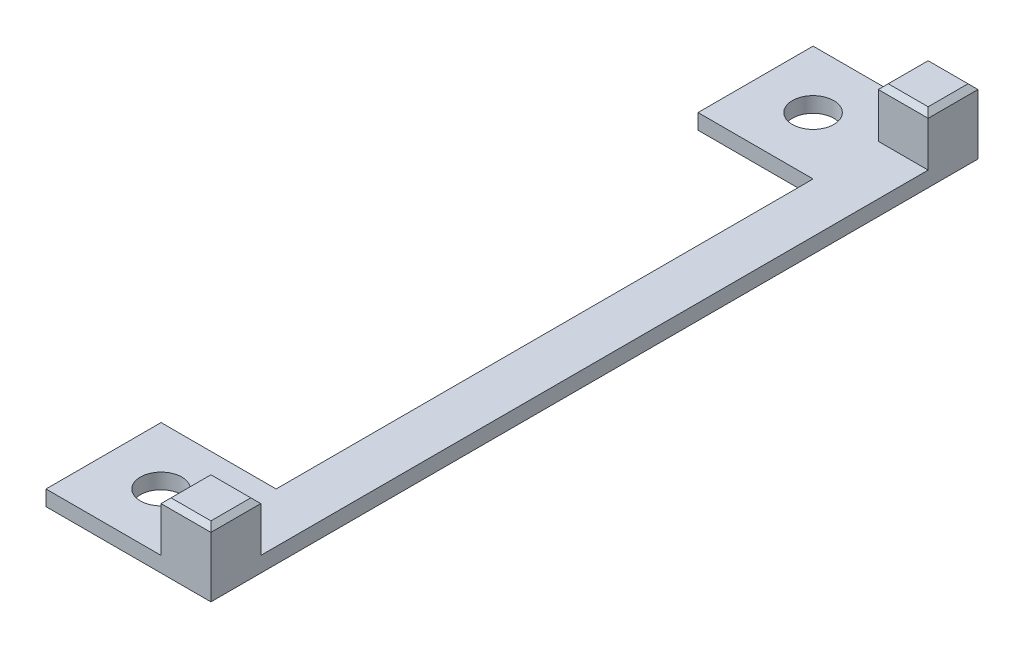
ISO-10303-21;
HEADER;
FILE_DESCRIPTION(('STEP AP214'),'2;1');
FILE_NAME('part.step','',(''),(''),'','','');
FILE_SCHEMA(('AUTOMOTIVE_DESIGN { 1 0 10303 214 1 1 1 1 }'));
ENDSEC;
DATA;
#1=APPLICATION_CONTEXT('core data for automotive mechanical design processes');
#2=APPLICATION_PROTOCOL_DEFINITION('international standard','automotive_design',2000,#1);
#3=PRODUCT_CONTEXT('',#1,'mechanical');
#4=PRODUCT('Part','Part','',(#3));
#5=PRODUCT_RELATED_PRODUCT_CATEGORY('part','',(#4));
#6=PRODUCT_DEFINITION_FORMATION('','',#4);
#7=PRODUCT_DEFINITION_CONTEXT('part definition',#1,'design');
#8=PRODUCT_DEFINITION('design','',#6,#7);
#9=PRODUCT_DEFINITION_SHAPE('','',#8);
#10=(LENGTH_UNIT() NAMED_UNIT(*) SI_UNIT(.MILLI.,.METRE.));
#11=(NAMED_UNIT(*) PLANE_ANGLE_UNIT() SI_UNIT($,.RADIAN.));
#12=(NAMED_UNIT(*) SI_UNIT($,.STERADIAN.) SOLID_ANGLE_UNIT());
#13=UNCERTAINTY_MEASURE_WITH_UNIT(LENGTH_MEASURE(1.E-05),#10,'distance_accuracy_value','');
#14=(GEOMETRIC_REPRESENTATION_CONTEXT(3) GLOBAL_UNCERTAINTY_ASSIGNED_CONTEXT((#13)) GLOBAL_UNIT_ASSIGNED_CONTEXT((#10,
#11,#12)) REPRESENTATION_CONTEXT('',''));
#15=CARTESIAN_POINT('',(0.,0.,0.));
#16=DIRECTION('',(0.,0.,1.));
#17=DIRECTION('',(1.,0.,0.));
#18=AXIS2_PLACEMENT_3D('',#15,#16,#17);
#19=CARTESIAN_POINT('',(-3.40641711229946,2.,90.2326203208556));
#20=DIRECTION('',(1.,0.,0.));
#21=DIRECTION('',(0.,0.,-1.));
#22=AXIS2_PLACEMENT_3D('',#19,#20,#21);
#23=PLANE('',#22);
#24=DIRECTION('',(0.,1.,0.));
#25=VECTOR('',#24,1.);
#26=CARTESIAN_POINT('',(-3.40641711229946,0.,81.7326203208556));
#27=LINE('',#26,#25);
#28=CARTESIAN_POINT('',(-3.40641711229946,0.,81.7326203208556));
#29=VERTEX_POINT('',#28);
#30=CARTESIAN_POINT('',(-3.40641711229946,2.,81.7326203208556));
#31=VERTEX_POINT('',#30);
#32=EDGE_CURVE('E346',#29,#31,#27,.T.);
#33=ORIENTED_EDGE('',*,*,#32,.T.);
#34=DIRECTION('',(0.,0.,1.));
#35=VECTOR('',#34,1.);
#36=CARTESIAN_POINT('',(-3.40641711229946,2.,90.2326203208556));
#37=LINE('',#36,#35);
#38=CARTESIAN_POINT('',(-3.40641711229946,2.,11.7326203208556));
#39=VERTEX_POINT('',#38);
#40=EDGE_CURVE('E221',#39,#31,#37,.T.);
#41=ORIENTED_EDGE('',*,*,#40,.F.);
#42=DIRECTION('',(0.,1.,0.));
#43=VECTOR('',#42,1.);
#44=CARTESIAN_POINT('',(-3.40641711229946,0.,11.7326203208556));
#45=LINE('',#44,#43);
#46=CARTESIAN_POINT('',(-3.40641711229946,0.,11.7326203208556));
#47=VERTEX_POINT('',#46);
#48=EDGE_CURVE('E245',#47,#39,#45,.T.);
#49=ORIENTED_EDGE('',*,*,#48,.F.);
#50=DIRECTION('',(0.,0.,1.));
#51=VECTOR('',#50,1.);
#52=CARTESIAN_POINT('',(-3.40641711229946,0.,90.2326203208556));
#53=LINE('',#52,#51);
#54=EDGE_CURVE('E226',#47,#29,#53,.T.);
#55=ORIENTED_EDGE('',*,*,#54,.T.);
#56=EDGE_LOOP('',(#33,#41,#49,#55));
#57=FACE_BOUND('',#56,.T.);
#58=ADVANCED_FACE('F45',(#57),#23,.F.);
#59=CARTESIAN_POINT('',(-3.40641711229946,8.5,3.23262032085562));
#60=DIRECTION('',(0.,0.,-1.));
#61=DIRECTION('',(-1.,0.,0.));
#62=AXIS2_PLACEMENT_3D('',#59,#60,#61);
#63=PLANE('',#62);
#64=DIRECTION('',(0.,-1.,0.));
#65=VECTOR('',#64,1.);
#66=CARTESIAN_POINT('',(3.09358288770054,8.5,3.23262032085562));
#67=LINE('',#66,#65);
#68=CARTESIAN_POINT('',(3.09358288770054,7.85,3.23262032085561));
#69=VERTEX_POINT('',#68);
#70=CARTESIAN_POINT('',(3.09358288770054,2.,3.23262032085562));
#71=VERTEX_POINT('',#70);
#72=EDGE_CURVE('E296',#69,#71,#67,.T.);
#73=ORIENTED_EDGE('',*,*,#72,.F.);
#74=DIRECTION('',(-1.,0.,0.));
#75=VECTOR('',#74,1.);
#76=CARTESIAN_POINT('',(3.09358288770054,7.85,3.23262032085562));
#77=LINE('',#76,#75);
#78=CARTESIAN_POINT('',(-3.40641711229947,7.85,3.23262032085562));
#79=VERTEX_POINT('',#78);
#80=EDGE_CURVE('E424',#69,#79,#77,.T.);
#81=ORIENTED_EDGE('',*,*,#80,.T.);
#82=DIRECTION('',(0.,-1.,0.));
#83=VECTOR('',#82,1.);
#84=CARTESIAN_POINT('',(-3.40641711229946,8.5,3.23262032085562));
#85=LINE('',#84,#83);
#86=CARTESIAN_POINT('',(-3.40641711229946,2.,3.23262032085562));
#87=VERTEX_POINT('',#86);
#88=EDGE_CURVE('E271',#79,#87,#85,.T.);
#89=ORIENTED_EDGE('',*,*,#88,.T.);
#90=DIRECTION('',(-1.,0.,0.));
#91=VECTOR('',#90,1.);
#92=CARTESIAN_POINT('',(-3.40641711229946,2.,3.23262032085562));
#93=LINE('',#92,#91);
#94=EDGE_CURVE('E234',#71,#87,#93,.T.);
#95=ORIENTED_EDGE('',*,*,#94,.F.);
#96=EDGE_LOOP('',(#73,#81,#89,#95));
#97=FACE_BOUND('',#96,.T.);
#98=ADVANCED_FACE('F423',(#97),#63,.F.);
#99=CARTESIAN_POINT('',(-3.40641711229946,8.5,-3.26737967914438));
#100=DIRECTION('',(1.,0.,0.));
#101=DIRECTION('',(0.,0.,-1.));
#102=AXIS2_PLACEMENT_3D('',#99,#100,#101);
#103=PLANE('',#102);
#104=ORIENTED_EDGE('',*,*,#88,.F.);
#105=DIRECTION('',(0.,0.,-1.));
#106=VECTOR('',#105,1.);
#107=CARTESIAN_POINT('',(-3.40641711229946,7.85,96.7326203208556));
#108=LINE('',#107,#106);
#109=CARTESIAN_POINT('',(-3.40641711229946,7.85,-3.26737967914438));
#110=VERTEX_POINT('',#109);
#111=EDGE_CURVE('E176',#79,#110,#108,.T.);
#112=ORIENTED_EDGE('',*,*,#111,.T.);
#113=DIRECTION('',(0.,-1.,0.));
#114=VECTOR('',#113,1.);
#115=CARTESIAN_POINT('',(-3.40641711229946,8.5,-3.26737967914438));
#116=LINE('',#115,#114);
#117=CARTESIAN_POINT('',(-3.40641711229946,2.,-3.26737967914438));
#118=VERTEX_POINT('',#117);
#119=EDGE_CURVE('E290',#110,#118,#116,.T.);
#120=ORIENTED_EDGE('',*,*,#119,.T.);
#121=DIRECTION('',(0.,0.,-1.));
#122=VECTOR('',#121,1.);
#123=CARTESIAN_POINT('',(-3.40641711229946,2.,-3.26737967914438));
#124=LINE('',#123,#122);
#125=EDGE_CURVE('E266',#87,#118,#124,.T.);
#126=ORIENTED_EDGE('',*,*,#125,.F.);
#127=EDGE_LOOP('',(#104,#112,#120,#126));
#128=FACE_BOUND('',#127,.T.);
#129=ADVANCED_FACE('F47',(#128),#103,.F.);
#130=CARTESIAN_POINT('',(3.09358288770054,8.5,-3.26737967914438));
#131=DIRECTION('',(-1.,0.,0.));
#132=DIRECTION('',(0.,0.,1.));
#133=AXIS2_PLACEMENT_3D('',#130,#131,#132);
#134=PLANE('',#133);
#135=DIRECTION('',(0.,-1.,0.));
#136=VECTOR('',#135,1.);
#137=CARTESIAN_POINT('',(3.09358288770054,8.5,-3.26737967914438));
#138=LINE('',#137,#136);
#139=CARTESIAN_POINT('',(3.09358288770054,7.85,-3.26737967914438));
#140=VERTEX_POINT('',#139);
#141=CARTESIAN_POINT('',(3.09358288770054,0.,-3.26737967914438));
#142=VERTEX_POINT('',#141);
#143=EDGE_CURVE('E293',#140,#142,#138,.T.);
#144=ORIENTED_EDGE('',*,*,#143,.F.);
#145=DIRECTION('',(0.,0.,-1.));
#146=VECTOR('',#145,1.);
#147=CARTESIAN_POINT('',(3.09358288770054,7.85,96.7326203208556));
#148=LINE('',#147,#146);
#149=EDGE_CURVE('E343',#69,#140,#148,.T.);
#150=ORIENTED_EDGE('',*,*,#149,.F.);
#151=ORIENTED_EDGE('',*,*,#72,.T.);
#152=DIRECTION('',(0.,0.,-1.));
#153=VECTOR('',#152,1.);
#154=CARTESIAN_POINT('',(3.09358288770054,2.,90.2326203208556));
#155=LINE('',#154,#153);
#156=CARTESIAN_POINT('',(3.09358288770054,2.,90.2326203208556));
#157=VERTEX_POINT('',#156);
#158=EDGE_CURVE('E230',#157,#71,#155,.T.);
#159=ORIENTED_EDGE('',*,*,#158,.F.);
#160=DIRECTION('',(0.,-1.,0.));
#161=VECTOR('',#160,1.);
#162=CARTESIAN_POINT('',(3.09358288770054,8.5,90.2326203208556));
#163=LINE('',#162,#161);
#164=CARTESIAN_POINT('',(3.09358288770055,7.85,90.2326203208556));
#165=VERTEX_POINT('',#164);
#166=EDGE_CURVE('E209',#165,#157,#163,.T.);
#167=ORIENTED_EDGE('',*,*,#166,.F.);
#168=CARTESIAN_POINT('',(3.09358288770054,7.85,96.7326203208556));
#169=VERTEX_POINT('',#168);
#170=EDGE_CURVE('E319',#169,#165,#148,.T.);
#171=ORIENTED_EDGE('',*,*,#170,.F.);
#172=DIRECTION('',(0.,-1.,0.));
#173=VECTOR('',#172,1.);
#174=CARTESIAN_POINT('',(3.09358288770054,8.5,96.7326203208556));
#175=LINE('',#174,#173);
#176=CARTESIAN_POINT('',(3.09358288770054,0.,96.7326203208556));
#177=VERTEX_POINT('',#176);
#178=EDGE_CURVE('E196',#169,#177,#175,.T.);
#179=ORIENTED_EDGE('',*,*,#178,.T.);
#180=DIRECTION('',(0.,0.,-1.));
#181=VECTOR('',#180,1.);
#182=CARTESIAN_POINT('',(3.09358288770054,0.,-3.26737967914438));
#183=LINE('',#182,#181);
#184=EDGE_CURVE('E283',#177,#142,#183,.T.);
#185=ORIENTED_EDGE('',*,*,#184,.T.);
#186=EDGE_LOOP('',(#144,#150,#151,#159,#167,#171,#179,#185));
#187=FACE_BOUND('',#186,.T.);
#188=ADVANCED_FACE('F411',(#187),#134,.F.);
#189=CARTESIAN_POINT('',(-3.40641711229946,8.5,-3.26737967914438));
#190=DIRECTION('',(0.,0.,1.));
#191=DIRECTION('',(1.,0.,0.));
#192=AXIS2_PLACEMENT_3D('',#189,#190,#191);
#193=PLANE('',#192);
#194=ORIENTED_EDGE('',*,*,#119,.F.);
#195=DIRECTION('',(-1.,0.,0.));
#196=VECTOR('',#195,1.);
#197=CARTESIAN_POINT('',(3.09358288770054,7.85,-3.26737967914438));
#198=LINE('',#197,#196);
#199=EDGE_CURVE('E407',#140,#110,#198,.T.);
#200=ORIENTED_EDGE('',*,*,#199,.F.);
#201=ORIENTED_EDGE('',*,*,#143,.T.);
#202=DIRECTION('',(-1.,0.,0.));
#203=VECTOR('',#202,1.);
#204=CARTESIAN_POINT('',(-3.40641711229946,0.,-3.26737967914438));
#205=LINE('',#204,#203);
#206=CARTESIAN_POINT('',(-18.4064171122995,0.,-3.26737967914438));
#207=VERTEX_POINT('',#206);
#208=EDGE_CURVE('E287',#142,#207,#205,.T.);
#209=ORIENTED_EDGE('',*,*,#208,.T.);
#210=DIRECTION('',(0.,-1.,0.));
#211=VECTOR('',#210,1.);
#212=CARTESIAN_POINT('',(-18.4064171122995,0.,-3.26737967914438));
#213=LINE('',#212,#211);
#214=CARTESIAN_POINT('',(-18.4064171122995,2.,-3.26737967914438));
#215=VERTEX_POINT('',#214);
#216=EDGE_CURVE('E249',#215,#207,#213,.T.);
#217=ORIENTED_EDGE('',*,*,#216,.F.);
#218=DIRECTION('',(1.,0.,0.));
#219=VECTOR('',#218,1.);
#220=CARTESIAN_POINT('',(-18.4064171122995,2.,-3.26737967914438));
#221=LINE('',#220,#219);
#222=EDGE_CURVE('E262',#215,#118,#221,.T.);
#223=ORIENTED_EDGE('',*,*,#222,.T.);
#224=EDGE_LOOP('',(#194,#200,#201,#209,#217,#223));
#225=FACE_BOUND('',#224,.T.);
#226=ADVANCED_FACE('F403',(#225),#193,.F.);
#227=CARTESIAN_POINT('',(0.,8.5,0.));
#228=DIRECTION('',(0.,1.,0.));
#229=DIRECTION('',(0.,0.,1.));
#230=AXIS2_PLACEMENT_3D('',#227,#228,#229);
#231=PLANE('',#230);
#232=DIRECTION('',(0.,0.,-1.));
#233=VECTOR('',#232,1.);
#234=CARTESIAN_POINT('',(-2.75641711229946,8.5,96.7326203208556));
#235=LINE('',#234,#233);
#236=CARTESIAN_POINT('',(-2.75641711229947,8.5,2.58262032085562));
#237=VERTEX_POINT('',#236);
#238=CARTESIAN_POINT('',(-2.75641711229946,8.5,-2.61737967914438));
#239=VERTEX_POINT('',#238);
#240=EDGE_CURVE('E61',#237,#239,#235,.T.);
#241=ORIENTED_EDGE('',*,*,#240,.F.);
#242=DIRECTION('',(-1.,0.,0.));
#243=VECTOR('',#242,1.);
#244=CARTESIAN_POINT('',(3.09358288770054,8.5,2.58262032085562));
#245=LINE('',#244,#243);
#246=CARTESIAN_POINT('',(2.44358288770054,8.5,2.58262032085561));
#247=VERTEX_POINT('',#246);
#248=EDGE_CURVE('E339',#247,#237,#245,.T.);
#249=ORIENTED_EDGE('',*,*,#248,.F.);
#250=DIRECTION('',(0.,0.,-1.));
#251=VECTOR('',#250,1.);
#252=CARTESIAN_POINT('',(2.44358288770054,8.5,96.7326203208556));
#253=LINE('',#252,#251);
#254=CARTESIAN_POINT('',(2.44358288770053,8.5,-2.61737967914438));
#255=VERTEX_POINT('',#254);
#256=EDGE_CURVE('E329',#247,#255,#253,.T.);
#257=ORIENTED_EDGE('',*,*,#256,.T.);
#258=DIRECTION('',(-1.,0.,0.));
#259=VECTOR('',#258,1.);
#260=CARTESIAN_POINT('',(3.09358288770054,8.5,-2.61737967914438));
#261=LINE('',#260,#259);
#262=EDGE_CURVE('E435',#255,#239,#261,.T.);
#263=ORIENTED_EDGE('',*,*,#262,.T.);
#264=EDGE_LOOP('',(#241,#249,#257,#263));
#265=FACE_BOUND('',#264,.T.);
#266=ADVANCED_FACE('F451',(#265),#231,.T.);
#267=CARTESIAN_POINT('',(0.,0.,0.));
#268=DIRECTION('',(0.,1.,0.));
#269=DIRECTION('',(0.,0.,1.));
#270=AXIS2_PLACEMENT_3D('',#267,#268,#269);
#271=PLANE('',#270);
#272=DIRECTION('',(1.,0.,0.));
#273=VECTOR('',#272,1.);
#274=CARTESIAN_POINT('',(-18.4064171122995,0.,81.7326203208556));
#275=LINE('',#274,#273);
#276=CARTESIAN_POINT('',(-18.4064171122995,0.,81.7326203208556));
#277=VERTEX_POINT('',#276);
#278=EDGE_CURVE('E212',#277,#29,#275,.T.);
#279=ORIENTED_EDGE('',*,*,#278,.T.);
#280=ORIENTED_EDGE('',*,*,#54,.F.);
#281=DIRECTION('',(1.,0.,0.));
#282=VECTOR('',#281,1.);
#283=CARTESIAN_POINT('',(-18.4064171122995,0.,11.7326203208556));
#284=LINE('',#283,#282);
#285=CARTESIAN_POINT('',(-18.4064171122995,0.,11.7326203208556));
#286=VERTEX_POINT('',#285);
#287=EDGE_CURVE('E279',#286,#47,#284,.T.);
#288=ORIENTED_EDGE('',*,*,#287,.F.);
#289=DIRECTION('',(0.,0.,1.));
#290=VECTOR('',#289,1.);
#291=CARTESIAN_POINT('',(-18.4064171122995,0.,-3.26737967914438));
#292=LINE('',#291,#290);
#293=EDGE_CURVE('E253',#207,#286,#292,.T.);
#294=ORIENTED_EDGE('',*,*,#293,.F.);
#295=ORIENTED_EDGE('',*,*,#208,.F.);
#296=ORIENTED_EDGE('',*,*,#184,.F.);
#297=DIRECTION('',(-1.,0.,0.));
#298=VECTOR('',#297,1.);
#299=CARTESIAN_POINT('',(-3.40641711229946,0.,96.7326203208556));
#300=LINE('',#299,#298);
#301=CARTESIAN_POINT('',(-18.4064171122995,0.,96.7326203208556));
#302=VERTEX_POINT('',#301);
#303=EDGE_CURVE('E205',#177,#302,#300,.T.);
#304=ORIENTED_EDGE('',*,*,#303,.T.);
#305=DIRECTION('',(0.,0.,-1.));
#306=VECTOR('',#305,1.);
#307=CARTESIAN_POINT('',(-18.4064171122995,0.,96.7326203208556));
#308=LINE('',#307,#306);
#309=EDGE_CURVE('E352',#302,#277,#308,.T.);
#310=ORIENTED_EDGE('',*,*,#309,.T.);
#311=EDGE_LOOP('',(#279,#280,#288,#294,#295,#296,#304,#310));
#312=FACE_BOUND('',#311,.T.);
#313=CARTESIAN_POINT('',(-10.9064171122995,0.,4.23262032085562));
#314=DIRECTION('',(0.,1.,0.));
#315=DIRECTION('',(0.,0.,1.));
#316=AXIS2_PLACEMENT_3D('',#313,#314,#315);
#317=CIRCLE('',#316,2.7);
#318=CARTESIAN_POINT('',(-10.9064171122995,0.,6.93262032085562));
#319=VERTEX_POINT('',#318);
#320=EDGE_CURVE('E241',#319,#319,#317,.T.);
#321=ORIENTED_EDGE('',*,*,#320,.T.);
#322=EDGE_LOOP('',(#321));
#323=FACE_BOUND('',#322,.T.);
#324=CARTESIAN_POINT('',(-10.9064171122995,0.,89.2326203208556));
#325=DIRECTION('',(0.,-1.,0.));
#326=DIRECTION('',(0.,0.,-1.));
#327=AXIS2_PLACEMENT_3D('',#324,#325,#326);
#328=CIRCLE('',#327,2.7);
#329=CARTESIAN_POINT('',(-10.9064171122995,0.,86.5326203208556));
#330=VERTEX_POINT('',#329);
#331=EDGE_CURVE('E334',#330,#330,#328,.T.);
#332=ORIENTED_EDGE('',*,*,#331,.F.);
#333=EDGE_LOOP('',(#332));
#334=FACE_BOUND('',#333,.T.);
#335=ADVANCED_FACE('F378',(#312,#323,#334),#271,.F.);
#336=CARTESIAN_POINT('',(-18.4064171122995,0.,11.7326203208556));
#337=DIRECTION('',(0.,0.,-1.));
#338=DIRECTION('',(-1.,0.,0.));
#339=AXIS2_PLACEMENT_3D('',#336,#337,#338);
#340=PLANE('',#339);
#341=ORIENTED_EDGE('',*,*,#48,.T.);
#342=DIRECTION('',(1.,0.,0.));
#343=VECTOR('',#342,1.);
#344=CARTESIAN_POINT('',(-18.4064171122995,2.,11.7326203208556));
#345=LINE('',#344,#343);
#346=CARTESIAN_POINT('',(-18.4064171122995,2.,11.7326203208556));
#347=VERTEX_POINT('',#346);
#348=EDGE_CURVE('E275',#347,#39,#345,.T.);
#349=ORIENTED_EDGE('',*,*,#348,.F.);
#350=DIRECTION('',(0.,1.,0.));
#351=VECTOR('',#350,1.);
#352=CARTESIAN_POINT('',(-18.4064171122995,0.,11.7326203208556));
#353=LINE('',#352,#351);
#354=EDGE_CURVE('E256',#286,#347,#353,.T.);
#355=ORIENTED_EDGE('',*,*,#354,.F.);
#356=ORIENTED_EDGE('',*,*,#287,.T.);
#357=EDGE_LOOP('',(#341,#349,#355,#356));
#358=FACE_BOUND('',#357,.T.);
#359=ADVANCED_FACE('F394',(#358),#340,.F.);
#360=CARTESIAN_POINT('',(-18.4064171122995,2.,-3.26737967914438));
#361=DIRECTION('',(0.,-1.,0.));
#362=DIRECTION('',(0.,0.,-1.));
#363=AXIS2_PLACEMENT_3D('',#360,#361,#362);
#364=PLANE('',#363);
#365=CARTESIAN_POINT('',(-10.9064171122995,2.,4.23262032085562));
#366=DIRECTION('',(0.,1.,0.));
#367=DIRECTION('',(0.,0.,1.));
#368=AXIS2_PLACEMENT_3D('',#365,#366,#367);
#369=CIRCLE('',#368,2.7);
#370=CARTESIAN_POINT('',(-10.9064171122995,2.,6.93262032085562));
#371=VERTEX_POINT('',#370);
#372=EDGE_CURVE('E238',#371,#371,#369,.T.);
#373=ORIENTED_EDGE('',*,*,#372,.F.);
#374=EDGE_LOOP('',(#373));
#375=FACE_BOUND('',#374,.T.);
#376=ORIENTED_EDGE('',*,*,#348,.T.);
#377=ORIENTED_EDGE('',*,*,#40,.T.);
#378=DIRECTION('',(1.,0.,0.));
#379=VECTOR('',#378,1.);
#380=CARTESIAN_POINT('',(-18.4064171122995,2.,81.7326203208556));
#381=LINE('',#380,#379);
#382=CARTESIAN_POINT('',(-18.4064171122995,2.,81.7326203208556));
#383=VERTEX_POINT('',#382);
#384=EDGE_CURVE('E370',#383,#31,#381,.T.);
#385=ORIENTED_EDGE('',*,*,#384,.F.);
#386=DIRECTION('',(0.,0.,1.));
#387=VECTOR('',#386,1.);
#388=CARTESIAN_POINT('',(-18.4064171122995,2.,96.7326203208556));
#389=LINE('',#388,#387);
#390=CARTESIAN_POINT('',(-18.4064171122995,2.,96.7326203208556));
#391=VERTEX_POINT('',#390);
#392=EDGE_CURVE('E360',#383,#391,#389,.T.);
#393=ORIENTED_EDGE('',*,*,#392,.T.);
#394=DIRECTION('',(1.,0.,0.));
#395=VECTOR('',#394,1.);
#396=CARTESIAN_POINT('',(-18.4064171122995,2.,96.7326203208556));
#397=LINE('',#396,#395);
#398=CARTESIAN_POINT('',(-3.40641711229946,2.,96.7326203208556));
#399=VERTEX_POINT('',#398);
#400=EDGE_CURVE('E363',#391,#399,#397,.T.);
#401=ORIENTED_EDGE('',*,*,#400,.T.);
#402=DIRECTION('',(0.,0.,1.));
#403=VECTOR('',#402,1.);
#404=CARTESIAN_POINT('',(-3.40641711229946,2.,96.7326203208556));
#405=LINE('',#404,#403);
#406=CARTESIAN_POINT('',(-3.40641711229946,2.,90.2326203208556));
#407=VERTEX_POINT('',#406);
#408=EDGE_CURVE('E203',#407,#399,#405,.T.);
#409=ORIENTED_EDGE('',*,*,#408,.F.);
#410=DIRECTION('',(1.,0.,0.));
#411=VECTOR('',#410,1.);
#412=CARTESIAN_POINT('',(-3.40641711229946,2.,90.2326203208556));
#413=LINE('',#412,#411);
#414=EDGE_CURVE('E225',#407,#157,#413,.T.);
#415=ORIENTED_EDGE('',*,*,#414,.T.);
#416=ORIENTED_EDGE('',*,*,#158,.T.);
#417=ORIENTED_EDGE('',*,*,#94,.T.);
#418=ORIENTED_EDGE('',*,*,#125,.T.);
#419=ORIENTED_EDGE('',*,*,#222,.F.);
#420=DIRECTION('',(0.,0.,-1.));
#421=VECTOR('',#420,1.);
#422=CARTESIAN_POINT('',(-18.4064171122995,2.,-3.26737967914438));
#423=LINE('',#422,#421);
#424=EDGE_CURVE('E259',#347,#215,#423,.T.);
#425=ORIENTED_EDGE('',*,*,#424,.F.);
#426=EDGE_LOOP('',(#376,#377,#385,#393,#401,#409,#415,#416,#417,#418,#419,#425));
#427=FACE_BOUND('',#426,.T.);
#428=CARTESIAN_POINT('',(-10.9064171122995,2.,89.2326203208556));
#429=DIRECTION('',(0.,-1.,0.));
#430=DIRECTION('',(0.,0.,-1.));
#431=AXIS2_PLACEMENT_3D('',#428,#429,#430);
#432=CIRCLE('',#431,2.7);
#433=CARTESIAN_POINT('',(-10.9064171122995,2.,86.5326203208556));
#434=VERTEX_POINT('',#433);
#435=EDGE_CURVE('E328',#434,#434,#432,.T.);
#436=ORIENTED_EDGE('',*,*,#435,.T.);
#437=EDGE_LOOP('',(#436));
#438=FACE_BOUND('',#437,.T.);
#439=ADVANCED_FACE('F387',(#375,#427,#438),#364,.F.);
#440=CARTESIAN_POINT('',(-18.4064171122995,0.,0.));
#441=DIRECTION('',(1.,0.,0.));
#442=DIRECTION('',(0.,0.,-1.));
#443=AXIS2_PLACEMENT_3D('',#440,#441,#442);
#444=PLANE('',#443);
#445=ORIENTED_EDGE('',*,*,#216,.T.);
#446=ORIENTED_EDGE('',*,*,#293,.T.);
#447=ORIENTED_EDGE('',*,*,#354,.T.);
#448=ORIENTED_EDGE('',*,*,#424,.T.);
#449=EDGE_LOOP('',(#445,#446,#447,#448));
#450=FACE_BOUND('',#449,.T.);
#451=ADVANCED_FACE('F400',(#450),#444,.F.);
#452=CARTESIAN_POINT('',(-10.9064171122995,0.,4.23262032085562));
#453=DIRECTION('',(0.,1.,0.));
#454=DIRECTION('',(0.,0.,1.));
#455=AXIS2_PLACEMENT_3D('',#452,#453,#454);
#456=CYLINDRICAL_SURFACE('',#455,2.7);
#457=ORIENTED_EDGE('',*,*,#320,.F.);
#458=EDGE_LOOP('',(#457));
#459=FACE_BOUND('',#458,.T.);
#460=ORIENTED_EDGE('',*,*,#372,.T.);
#461=EDGE_LOOP('',(#460));
#462=FACE_BOUND('',#461,.T.);
#463=ADVANCED_FACE('F475',(#459,#462),#456,.F.);
#464=CARTESIAN_POINT('',(-3.40641711229946,8.5,90.2326203208556));
#465=DIRECTION('',(0.,0.,1.));
#466=DIRECTION('',(-1.,0.,0.));
#467=AXIS2_PLACEMENT_3D('',#464,#465,#466);
#468=PLANE('',#467);
#469=DIRECTION('',(0.,-1.,0.));
#470=VECTOR('',#469,1.);
#471=CARTESIAN_POINT('',(-3.40641711229946,8.5,90.2326203208556));
#472=LINE('',#471,#470);
#473=CARTESIAN_POINT('',(-3.40641711229947,7.85,90.2326203208556));
#474=VERTEX_POINT('',#473);
#475=EDGE_CURVE('E218',#474,#407,#472,.T.);
#476=ORIENTED_EDGE('',*,*,#475,.F.);
#477=DIRECTION('',(-1.,0.,0.));
#478=VECTOR('',#477,1.);
#479=CARTESIAN_POINT('',(3.09358288770055,7.85,90.2326203208556));
#480=LINE('',#479,#478);
#481=EDGE_CURVE('E440',#165,#474,#480,.T.);
#482=ORIENTED_EDGE('',*,*,#481,.F.);
#483=ORIENTED_EDGE('',*,*,#166,.T.);
#484=ORIENTED_EDGE('',*,*,#414,.F.);
#485=EDGE_LOOP('',(#476,#482,#483,#484));
#486=FACE_BOUND('',#485,.T.);
#487=ADVANCED_FACE('F477',(#486),#468,.F.);
#488=CARTESIAN_POINT('',(-3.40641711229946,8.5,96.7326203208556));
#489=DIRECTION('',(1.,0.,0.));
#490=DIRECTION('',(0.,0.,1.));
#491=AXIS2_PLACEMENT_3D('',#488,#489,#490);
#492=PLANE('',#491);
#493=DIRECTION('',(0.,-1.,0.));
#494=VECTOR('',#493,1.);
#495=CARTESIAN_POINT('',(-3.40641711229946,8.5,96.7326203208556));
#496=LINE('',#495,#494);
#497=CARTESIAN_POINT('',(-3.40641711229946,7.85,96.7326203208556));
#498=VERTEX_POINT('',#497);
#499=EDGE_CURVE('E193',#498,#399,#496,.T.);
#500=ORIENTED_EDGE('',*,*,#499,.F.);
#501=EDGE_CURVE('E168',#498,#474,#108,.T.);
#502=ORIENTED_EDGE('',*,*,#501,.T.);
#503=ORIENTED_EDGE('',*,*,#475,.T.);
#504=ORIENTED_EDGE('',*,*,#408,.T.);
#505=EDGE_LOOP('',(#500,#502,#503,#504));
#506=FACE_BOUND('',#505,.T.);
#507=ADVANCED_FACE('F201',(#506),#492,.F.);
#508=CARTESIAN_POINT('',(-3.40641711229946,8.5,96.7326203208556));
#509=DIRECTION('',(0.,0.,-1.));
#510=DIRECTION('',(1.,0.,0.));
#511=AXIS2_PLACEMENT_3D('',#508,#509,#510);
#512=PLANE('',#511);
#513=ORIENTED_EDGE('',*,*,#178,.F.);
#514=DIRECTION('',(-1.,0.,0.));
#515=VECTOR('',#514,1.);
#516=CARTESIAN_POINT('',(3.09358288770055,7.85,96.7326203208556));
#517=LINE('',#516,#515);
#518=EDGE_CURVE('E182',#169,#498,#517,.T.);
#519=ORIENTED_EDGE('',*,*,#518,.T.);
#520=ORIENTED_EDGE('',*,*,#499,.T.);
#521=ORIENTED_EDGE('',*,*,#400,.F.);
#522=DIRECTION('',(0.,-1.,0.));
#523=VECTOR('',#522,1.);
#524=CARTESIAN_POINT('',(-18.4064171122995,0.,96.7326203208556));
#525=LINE('',#524,#523);
#526=EDGE_CURVE('E348',#391,#302,#525,.T.);
#527=ORIENTED_EDGE('',*,*,#526,.T.);
#528=ORIENTED_EDGE('',*,*,#303,.F.);
#529=EDGE_LOOP('',(#513,#519,#520,#521,#527,#528));
#530=FACE_BOUND('',#529,.T.);
#531=ADVANCED_FACE('F191',(#530),#512,.F.);
#532=CARTESIAN_POINT('',(0.,8.5,93.4652406417112));
#533=DIRECTION('',(0.,1.,0.));
#534=DIRECTION('',(0.,0.,-1.));
#535=AXIS2_PLACEMENT_3D('',#532,#533,#534);
#536=PLANE('',#535);
#537=CARTESIAN_POINT('',(-2.75641711229947,8.5,96.0826203208556));
#538=VERTEX_POINT('',#537);
#539=CARTESIAN_POINT('',(-2.75641711229947,8.5,90.8826203208556));
#540=VERTEX_POINT('',#539);
#541=EDGE_CURVE('E69',#538,#540,#235,.T.);
#542=ORIENTED_EDGE('',*,*,#541,.F.);
#543=DIRECTION('',(-1.,0.,0.));
#544=VECTOR('',#543,1.);
#545=CARTESIAN_POINT('',(3.09358288770055,8.5,96.0826203208556));
#546=LINE('',#545,#544);
#547=CARTESIAN_POINT('',(2.44358288770053,8.5,96.0826203208556));
#548=VERTEX_POINT('',#547);
#549=EDGE_CURVE('E185',#548,#538,#546,.T.);
#550=ORIENTED_EDGE('',*,*,#549,.F.);
#551=CARTESIAN_POINT('',(2.44358288770054,8.5,90.8826203208556));
#552=VERTEX_POINT('',#551);
#553=EDGE_CURVE('E317',#548,#552,#253,.T.);
#554=ORIENTED_EDGE('',*,*,#553,.T.);
#555=DIRECTION('',(-1.,0.,0.));
#556=VECTOR('',#555,1.);
#557=CARTESIAN_POINT('',(3.09358288770055,8.5,90.8826203208556));
#558=LINE('',#557,#556);
#559=EDGE_CURVE('E326',#552,#540,#558,.T.);
#560=ORIENTED_EDGE('',*,*,#559,.T.);
#561=EDGE_LOOP('',(#542,#550,#554,#560));
#562=FACE_BOUND('',#561,.T.);
#563=ADVANCED_FACE('F325',(#562),#536,.T.);
#564=CARTESIAN_POINT('',(-18.4064171122995,0.,81.7326203208556));
#565=DIRECTION('',(0.,0.,1.));
#566=DIRECTION('',(-1.,0.,0.));
#567=AXIS2_PLACEMENT_3D('',#564,#565,#566);
#568=PLANE('',#567);
#569=ORIENTED_EDGE('',*,*,#32,.F.);
#570=ORIENTED_EDGE('',*,*,#278,.F.);
#571=DIRECTION('',(0.,1.,0.));
#572=VECTOR('',#571,1.);
#573=CARTESIAN_POINT('',(-18.4064171122995,0.,81.7326203208556));
#574=LINE('',#573,#572);
#575=EDGE_CURVE('E356',#277,#383,#574,.T.);
#576=ORIENTED_EDGE('',*,*,#575,.T.);
#577=ORIENTED_EDGE('',*,*,#384,.T.);
#578=EDGE_LOOP('',(#569,#570,#576,#577));
#579=FACE_BOUND('',#578,.T.);
#580=ADVANCED_FACE('F383',(#579),#568,.F.);
#581=CARTESIAN_POINT('',(-18.4064171122995,0.,93.4652406417112));
#582=DIRECTION('',(1.,0.,0.));
#583=DIRECTION('',(0.,0.,1.));
#584=AXIS2_PLACEMENT_3D('',#581,#582,#583);
#585=PLANE('',#584);
#586=ORIENTED_EDGE('',*,*,#526,.F.);
#587=ORIENTED_EDGE('',*,*,#392,.F.);
#588=ORIENTED_EDGE('',*,*,#575,.F.);
#589=ORIENTED_EDGE('',*,*,#309,.F.);
#590=EDGE_LOOP('',(#586,#587,#588,#589));
#591=FACE_BOUND('',#590,.T.);
#592=ADVANCED_FACE('F414',(#591),#585,.F.);
#593=CARTESIAN_POINT('',(-10.9064171122995,0.,89.2326203208556));
#594=DIRECTION('',(0.,1.,0.));
#595=DIRECTION('',(0.,0.,-1.));
#596=AXIS2_PLACEMENT_3D('',#593,#594,#595);
#597=CYLINDRICAL_SURFACE('',#596,2.7);
#598=ORIENTED_EDGE('',*,*,#331,.T.);
#599=EDGE_LOOP('',(#598));
#600=FACE_BOUND('',#599,.T.);
#601=ORIENTED_EDGE('',*,*,#435,.F.);
#602=EDGE_LOOP('',(#601));
#603=FACE_BOUND('',#602,.T.);
#604=ADVANCED_FACE('F463',(#600,#603),#597,.F.);
#605=CARTESIAN_POINT('',(2.44358288770054,8.5,96.7326203208556));
#606=DIRECTION('',(-0.707106781186547,-0.707106781186548,0.));
#607=DIRECTION('',(0.707106781186548,-0.707106781186547,0.));
#608=AXIS2_PLACEMENT_3D('',#605,#606,#607);
#609=PLANE('',#608);
#610=ORIENTED_EDGE('',*,*,#170,.T.);
#611=DIRECTION('',(-0.577350269189627,0.577350269189626,0.577350269189625));
#612=VECTOR('',#611,1.);
#613=CARTESIAN_POINT('',(0.493582887700534,10.45,92.8326203208556));
#614=LINE('',#613,#612);
#615=EDGE_CURVE('E54',#165,#552,#614,.T.);
#616=ORIENTED_EDGE('',*,*,#615,.T.);
#617=ORIENTED_EDGE('',*,*,#553,.F.);
#618=DIRECTION('',(0.577350269189627,-0.577350269189626,0.577350269189625));
#619=VECTOR('',#618,1.);
#620=CARTESIAN_POINT('',(2.6602495543672,8.28333333333333,96.2992869875223));
#621=LINE('',#620,#619);
#622=EDGE_CURVE('E308',#548,#169,#621,.T.);
#623=ORIENTED_EDGE('',*,*,#622,.T.);
#624=EDGE_LOOP('',(#610,#616,#617,#623));
#625=FACE_BOUND('',#624,.T.);
#626=ADVANCED_FACE('F316',(#625),#609,.F.);
#627=ORIENTED_EDGE('',*,*,#149,.T.);
#628=DIRECTION('',(-0.577350269189626,0.577350269189626,0.577350269189626));
#629=VECTOR('',#628,1.);
#630=CARTESIAN_POINT('',(-30.6730837789662,41.6166666666667,30.4992869875223));
#631=LINE('',#630,#629);
#632=EDGE_CURVE('E304',#140,#255,#631,.T.);
#633=ORIENTED_EDGE('',*,*,#632,.T.);
#634=ORIENTED_EDGE('',*,*,#256,.F.);
#635=DIRECTION('',(0.577350269189626,-0.577350269189626,0.577350269189626));
#636=VECTOR('',#635,1.);
#637=CARTESIAN_POINT('',(33.8269162210339,-22.8833333333333,33.9659536541889));
#638=LINE('',#637,#636);
#639=EDGE_CURVE('E270',#247,#69,#638,.T.);
#640=ORIENTED_EDGE('',*,*,#639,.T.);
#641=EDGE_LOOP('',(#627,#633,#634,#640));
#642=FACE_BOUND('',#641,.T.);
#643=ADVANCED_FACE('F453',(#642),#609,.F.);
#644=CARTESIAN_POINT('',(3.09358288770054,8.5,2.58262032085562));
#645=DIRECTION('',(0.,-0.707106781186548,-0.707106781186547));
#646=DIRECTION('',(0.,0.707106781186547,-0.707106781186548));
#647=AXIS2_PLACEMENT_3D('',#644,#645,#646);
#648=PLANE('',#647);
#649=ORIENTED_EDGE('',*,*,#248,.T.);
#650=DIRECTION('',(-0.577350269189626,-0.577350269189626,0.577350269189626));
#651=VECTOR('',#650,1.);
#652=CARTESIAN_POINT('',(-0.806417112299462,10.45,0.632620320855614));
#653=LINE('',#652,#651);
#654=EDGE_CURVE('E198',#237,#79,#653,.T.);
#655=ORIENTED_EDGE('',*,*,#654,.T.);
#656=ORIENTED_EDGE('',*,*,#80,.F.);
#657=ORIENTED_EDGE('',*,*,#639,.F.);
#658=EDGE_LOOP('',(#649,#655,#656,#657));
#659=FACE_BOUND('',#658,.T.);
#660=ADVANCED_FACE('F448',(#659),#648,.F.);
#661=CARTESIAN_POINT('',(3.09358288770054,8.5,-2.61737967914438));
#662=DIRECTION('',(0.,-0.707106781186548,0.707106781186547));
#663=DIRECTION('',(0.,-0.707106781186547,-0.707106781186548));
#664=AXIS2_PLACEMENT_3D('',#661,#662,#663);
#665=PLANE('',#664);
#666=ORIENTED_EDGE('',*,*,#199,.T.);
#667=DIRECTION('',(0.577350269189626,0.577350269189626,0.577350269189626));
#668=VECTOR('',#667,1.);
#669=CARTESIAN_POINT('',(-0.806417112299462,10.45,-0.667379679144381));
#670=LINE('',#669,#668);
#671=EDGE_CURVE('E187',#110,#239,#670,.T.);
#672=ORIENTED_EDGE('',*,*,#671,.T.);
#673=ORIENTED_EDGE('',*,*,#262,.F.);
#674=ORIENTED_EDGE('',*,*,#632,.F.);
#675=EDGE_LOOP('',(#666,#672,#673,#674));
#676=FACE_BOUND('',#675,.T.);
#677=ADVANCED_FACE('F432',(#676),#665,.F.);
#678=CARTESIAN_POINT('',(3.09358288770055,8.5,96.0826203208556));
#679=DIRECTION('',(0.,-0.707106781186546,-0.707106781186548));
#680=DIRECTION('',(0.,0.707106781186548,-0.707106781186547));
#681=AXIS2_PLACEMENT_3D('',#678,#679,#680);
#682=PLANE('',#681);
#683=ORIENTED_EDGE('',*,*,#549,.T.);
#684=DIRECTION('',(-0.577350269189627,-0.577350269189626,0.577350269189625));
#685=VECTOR('',#684,1.);
#686=CARTESIAN_POINT('',(-0.806417112299453,10.45,94.1326203208556));
#687=LINE('',#686,#685);
#688=EDGE_CURVE('E171',#538,#498,#687,.T.);
#689=ORIENTED_EDGE('',*,*,#688,.T.);
#690=ORIENTED_EDGE('',*,*,#518,.F.);
#691=ORIENTED_EDGE('',*,*,#622,.F.);
#692=EDGE_LOOP('',(#683,#689,#690,#691));
#693=FACE_BOUND('',#692,.T.);
#694=ADVANCED_FACE('F181',(#693),#682,.F.);
#695=CARTESIAN_POINT('',(3.09358288770055,8.5,90.8826203208556));
#696=DIRECTION('',(0.,-0.707106781186546,0.707106781186548));
#697=DIRECTION('',(0.,-0.707106781186548,-0.707106781186547));
#698=AXIS2_PLACEMENT_3D('',#695,#696,#697);
#699=PLANE('',#698);
#700=ORIENTED_EDGE('',*,*,#481,.T.);
#701=DIRECTION('',(0.577350269189627,0.577350269189626,0.577350269189625));
#702=VECTOR('',#701,1.);
#703=CARTESIAN_POINT('',(-0.806417112299454,10.45,92.8326203208556));
#704=LINE('',#703,#702);
#705=EDGE_CURVE('E11',#474,#540,#704,.T.);
#706=ORIENTED_EDGE('',*,*,#705,.T.);
#707=ORIENTED_EDGE('',*,*,#559,.F.);
#708=ORIENTED_EDGE('',*,*,#615,.F.);
#709=EDGE_LOOP('',(#700,#706,#707,#708));
#710=FACE_BOUND('',#709,.T.);
#711=ADVANCED_FACE('F556',(#710),#699,.F.);
#712=CARTESIAN_POINT('',(-2.75641711229946,8.5,96.7326203208556));
#713=DIRECTION('',(0.707106781186547,-0.707106781186548,0.));
#714=DIRECTION('',(0.707106781186548,0.707106781186547,0.));
#715=AXIS2_PLACEMENT_3D('',#712,#713,#714);
#716=PLANE('',#715);
#717=ORIENTED_EDGE('',*,*,#541,.T.);
#718=ORIENTED_EDGE('',*,*,#705,.F.);
#719=ORIENTED_EDGE('',*,*,#501,.F.);
#720=ORIENTED_EDGE('',*,*,#688,.F.);
#721=EDGE_LOOP('',(#717,#718,#719,#720));
#722=FACE_BOUND('',#721,.T.);
#723=ADVANCED_FACE('F170',(#722),#716,.F.);
#724=ORIENTED_EDGE('',*,*,#240,.T.);
#725=ORIENTED_EDGE('',*,*,#671,.F.);
#726=ORIENTED_EDGE('',*,*,#111,.F.);
#727=ORIENTED_EDGE('',*,*,#654,.F.);
#728=EDGE_LOOP('',(#724,#725,#726,#727));
#729=FACE_BOUND('',#728,.T.);
#730=ADVANCED_FACE('F571',(#729),#716,.F.);
#731=CLOSED_SHELL('',(#58,#98,#129,#188,#226,#266,#335,#359,#439,#451,#463,#487,#507,#531,#563,
#580,#592,#604,#626,#643,#660,#677,#694,#711,#723,#730));
#732=MANIFOLD_SOLID_BREP('B2',#731);
#733=ADVANCED_BREP_SHAPE_REPRESENTATION('',(#18,#732),#14);
#734=SHAPE_DEFINITION_REPRESENTATION(#9,#733);
ENDSEC;
END-ISO-10303-21;
